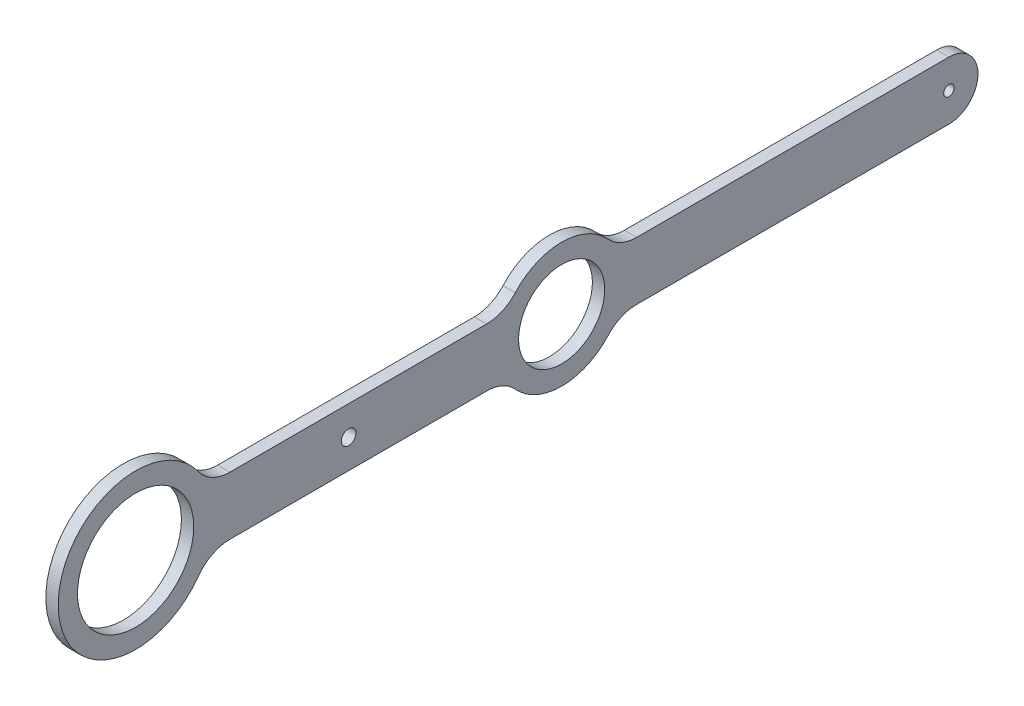
ISO-10303-21;
HEADER;
FILE_DESCRIPTION(('STEP AP214'),'2;1');
FILE_NAME('part.step','',(''),(''),'','','');
FILE_SCHEMA(('AUTOMOTIVE_DESIGN { 1 0 10303 214 1 1 1 1 }'));
ENDSEC;
DATA;
#1=APPLICATION_CONTEXT('core data for automotive mechanical design processes');
#2=APPLICATION_PROTOCOL_DEFINITION('international standard','automotive_design',2000,#1);
#3=PRODUCT_CONTEXT('',#1,'mechanical');
#4=PRODUCT('Part','Part','',(#3));
#5=PRODUCT_RELATED_PRODUCT_CATEGORY('part','',(#4));
#6=PRODUCT_DEFINITION_FORMATION('','',#4);
#7=PRODUCT_DEFINITION_CONTEXT('part definition',#1,'design');
#8=PRODUCT_DEFINITION('design','',#6,#7);
#9=PRODUCT_DEFINITION_SHAPE('','',#8);
#10=(LENGTH_UNIT() NAMED_UNIT(*) SI_UNIT(.MILLI.,.METRE.));
#11=(NAMED_UNIT(*) PLANE_ANGLE_UNIT() SI_UNIT($,.RADIAN.));
#12=(NAMED_UNIT(*) SI_UNIT($,.STERADIAN.) SOLID_ANGLE_UNIT());
#13=UNCERTAINTY_MEASURE_WITH_UNIT(LENGTH_MEASURE(1.E-05),#10,'distance_accuracy_value','');
#14=(GEOMETRIC_REPRESENTATION_CONTEXT(3) GLOBAL_UNCERTAINTY_ASSIGNED_CONTEXT((#13)) GLOBAL_UNIT_ASSIGNED_CONTEXT((#10,
#11,#12)) REPRESENTATION_CONTEXT('',''));
#15=CARTESIAN_POINT('',(0.,0.,0.));
#16=DIRECTION('',(0.,0.,1.));
#17=DIRECTION('',(1.,0.,0.));
#18=AXIS2_PLACEMENT_3D('',#15,#16,#17);
#19=CARTESIAN_POINT('',(3.175,0.,110.));
#20=DIRECTION('',(-1.,0.,0.));
#21=DIRECTION('',(0.,0.,1.));
#22=AXIS2_PLACEMENT_3D('',#19,#20,#21);
#23=CYLINDRICAL_SURFACE('',#22,20.);
#24=CARTESIAN_POINT('',(0.,0.,110.));
#25=DIRECTION('',(1.,0.,0.));
#26=DIRECTION('',(0.,0.,-1.));
#27=AXIS2_PLACEMENT_3D('',#24,#25,#26);
#28=CIRCLE('',#27,20.);
#29=CARTESIAN_POINT('',(0.,11.6666666666667,93.7553427586517));
#30=VERTEX_POINT('',#29);
#31=CARTESIAN_POINT('',(0.,-11.6666666666667,93.7553427586517));
#32=VERTEX_POINT('',#31);
#33=EDGE_CURVE('E194',#30,#32,#28,.T.);
#34=ORIENTED_EDGE('',*,*,#33,.T.);
#35=DIRECTION('',(-1.,0.,0.));
#36=VECTOR('',#35,1.);
#37=CARTESIAN_POINT('',(3.175,-11.6666666666667,93.7553427586517));
#38=LINE('',#37,#36);
#39=CARTESIAN_POINT('',(3.175,-11.6666666666667,93.7553427586517));
#40=VERTEX_POINT('',#39);
#41=EDGE_CURVE('E60',#32,#40,#38,.F.);
#42=ORIENTED_EDGE('',*,*,#41,.T.);
#43=CARTESIAN_POINT('',(3.175,0.,110.));
#44=DIRECTION('',(1.,0.,0.));
#45=DIRECTION('',(0.,0.,-1.));
#46=AXIS2_PLACEMENT_3D('',#43,#44,#45);
#47=CIRCLE('',#46,20.);
#48=CARTESIAN_POINT('',(3.175,11.6666666666667,93.7553427586517));
#49=VERTEX_POINT('',#48);
#50=EDGE_CURVE('E223',#49,#40,#47,.T.);
#51=ORIENTED_EDGE('',*,*,#50,.F.);
#52=DIRECTION('',(-1.,0.,0.));
#53=VECTOR('',#52,1.);
#54=CARTESIAN_POINT('',(3.175,11.6666666666667,93.7553427586517));
#55=LINE('',#54,#53);
#56=EDGE_CURVE('E248',#49,#30,#55,.T.);
#57=ORIENTED_EDGE('',*,*,#56,.T.);
#58=EDGE_LOOP('',(#34,#42,#51,#57));
#59=FACE_BOUND('',#58,.T.);
#60=ADVANCED_FACE('F42',(#59),#23,.T.);
#61=CARTESIAN_POINT('',(3.175,-7.5,0.));
#62=DIRECTION('',(0.,1.,0.));
#63=DIRECTION('',(0.,0.,1.));
#64=AXIS2_PLACEMENT_3D('',#61,#62,#63);
#65=PLANE('',#64);
#66=DIRECTION('',(0.,0.,-1.));
#67=VECTOR('',#66,1.);
#68=CARTESIAN_POINT('',(0.,-7.5,0.));
#69=LINE('',#68,#67);
#70=CARTESIAN_POINT('',(0.,-7.5,85.6330141379776));
#71=VERTEX_POINT('',#70);
#72=CARTESIAN_POINT('',(0.,-7.5,19.3807289917072));
#73=VERTEX_POINT('',#72);
#74=EDGE_CURVE('E197',#71,#73,#69,.T.);
#75=ORIENTED_EDGE('',*,*,#74,.T.);
#76=DIRECTION('',(1.,0.,0.));
#77=VECTOR('',#76,1.);
#78=CARTESIAN_POINT('',(3.175,-7.5,19.3807289917072));
#79=LINE('',#78,#77);
#80=CARTESIAN_POINT('',(3.175,-7.5,19.3807289917072));
#81=VERTEX_POINT('',#80);
#82=EDGE_CURVE('E246',#73,#81,#79,.T.);
#83=ORIENTED_EDGE('',*,*,#82,.T.);
#84=DIRECTION('',(0.,0.,-1.));
#85=VECTOR('',#84,1.);
#86=CARTESIAN_POINT('',(3.175,-7.5,0.));
#87=LINE('',#86,#85);
#88=CARTESIAN_POINT('',(3.175,-7.5,85.6330141379776));
#89=VERTEX_POINT('',#88);
#90=EDGE_CURVE('E287',#89,#81,#87,.T.);
#91=ORIENTED_EDGE('',*,*,#90,.F.);
#92=DIRECTION('',(1.,0.,0.));
#93=VECTOR('',#92,1.);
#94=CARTESIAN_POINT('',(0.,-7.5,85.6330141379776));
#95=LINE('',#94,#93);
#96=EDGE_CURVE('E243',#89,#71,#95,.F.);
#97=ORIENTED_EDGE('',*,*,#96,.T.);
#98=EDGE_LOOP('',(#75,#83,#91,#97));
#99=FACE_BOUND('',#98,.T.);
#100=ADVANCED_FACE('F328',(#99),#65,.F.);
#101=CARTESIAN_POINT('',(3.175,0.,0.));
#102=DIRECTION('',(-1.,0.,0.));
#103=DIRECTION('',(0.,0.,1.));
#104=AXIS2_PLACEMENT_3D('',#101,#102,#103);
#105=CYLINDRICAL_SURFACE('',#104,16.1125);
#106=CARTESIAN_POINT('',(0.,0.,0.));
#107=DIRECTION('',(1.,0.,0.));
#108=DIRECTION('',(0.,0.,-1.));
#109=AXIS2_PLACEMENT_3D('',#106,#107,#108);
#110=CIRCLE('',#109,16.1125);
#111=CARTESIAN_POINT('',(0.,-10.7982288176161,11.9587169316949));
#112=VERTEX_POINT('',#111);
#113=CARTESIAN_POINT('',(0.,-10.7982288176161,-11.9587169316949));
#114=VERTEX_POINT('',#113);
#115=EDGE_CURVE('E201',#112,#114,#110,.T.);
#116=ORIENTED_EDGE('',*,*,#115,.T.);
#117=DIRECTION('',(-1.,0.,0.));
#118=VECTOR('',#117,1.);
#119=CARTESIAN_POINT('',(3.175,-10.7982288176161,-11.9587169316949));
#120=LINE('',#119,#118);
#121=CARTESIAN_POINT('',(3.175,-10.7982288176161,-11.9587169316949));
#122=VERTEX_POINT('',#121);
#123=EDGE_CURVE('E241',#114,#122,#120,.F.);
#124=ORIENTED_EDGE('',*,*,#123,.T.);
#125=CARTESIAN_POINT('',(3.175,0.,0.));
#126=DIRECTION('',(1.,0.,0.));
#127=DIRECTION('',(0.,0.,-1.));
#128=AXIS2_PLACEMENT_3D('',#125,#126,#127);
#129=CIRCLE('',#128,16.1125);
#130=CARTESIAN_POINT('',(3.175,-10.7982288176161,11.9587169316949));
#131=VERTEX_POINT('',#130);
#132=EDGE_CURVE('E159',#131,#122,#129,.T.);
#133=ORIENTED_EDGE('',*,*,#132,.F.);
#134=DIRECTION('',(-1.,0.,0.));
#135=VECTOR('',#134,1.);
#136=CARTESIAN_POINT('',(3.175,-10.7982288176161,11.9587169316949));
#137=LINE('',#136,#135);
#138=EDGE_CURVE('E238',#131,#112,#137,.T.);
#139=ORIENTED_EDGE('',*,*,#138,.T.);
#140=EDGE_LOOP('',(#116,#124,#133,#139));
#141=FACE_BOUND('',#140,.T.);
#142=ADVANCED_FACE('F333',(#141),#105,.T.);
#143=CARTESIAN_POINT('',(3.175,-7.50000000000001,0.));
#144=DIRECTION('',(0.,1.,0.));
#145=DIRECTION('',(0.,0.,1.));
#146=AXIS2_PLACEMENT_3D('',#143,#144,#145);
#147=PLANE('',#146);
#148=DIRECTION('',(0.,0.,-1.));
#149=VECTOR('',#148,1.);
#150=CARTESIAN_POINT('',(3.175,-7.50000000000001,0.));
#151=LINE('',#150,#149);
#152=CARTESIAN_POINT('',(3.175,-7.5,-19.3807289917072));
#153=VERTEX_POINT('',#152);
#154=CARTESIAN_POINT('',(3.175,-7.49999999999996,-100.));
#155=VERTEX_POINT('',#154);
#156=EDGE_CURVE('E146',#153,#155,#151,.T.);
#157=ORIENTED_EDGE('',*,*,#156,.F.);
#158=DIRECTION('',(1.,0.,0.));
#159=VECTOR('',#158,1.);
#160=CARTESIAN_POINT('',(0.,-7.5,-19.3807289917072));
#161=LINE('',#160,#159);
#162=CARTESIAN_POINT('',(0.,-7.5,-19.3807289917072));
#163=VERTEX_POINT('',#162);
#164=EDGE_CURVE('E236',#153,#163,#161,.F.);
#165=ORIENTED_EDGE('',*,*,#164,.T.);
#166=DIRECTION('',(0.,0.,-1.));
#167=VECTOR('',#166,1.);
#168=CARTESIAN_POINT('',(0.,-7.50000000000001,0.));
#169=LINE('',#168,#167);
#170=CARTESIAN_POINT('',(0.,-7.49999999999996,-100.));
#171=VERTEX_POINT('',#170);
#172=EDGE_CURVE('E165',#163,#171,#169,.T.);
#173=ORIENTED_EDGE('',*,*,#172,.T.);
#174=DIRECTION('',(-1.,0.,0.));
#175=VECTOR('',#174,1.);
#176=CARTESIAN_POINT('',(3.175,-7.49999999999996,-100.));
#177=LINE('',#176,#175);
#178=EDGE_CURVE('E162',#155,#171,#177,.T.);
#179=ORIENTED_EDGE('',*,*,#178,.F.);
#180=EDGE_LOOP('',(#157,#165,#173,#179));
#181=FACE_BOUND('',#180,.T.);
#182=ADVANCED_FACE('F163',(#181),#147,.F.);
#183=CARTESIAN_POINT('',(3.175,0.,-100.));
#184=DIRECTION('',(-1.,0.,0.));
#185=DIRECTION('',(0.,0.,1.));
#186=AXIS2_PLACEMENT_3D('',#183,#184,#185);
#187=CYLINDRICAL_SURFACE('',#186,7.5);
#188=CARTESIAN_POINT('',(0.,0.,-100.));
#189=DIRECTION('',(1.,0.,0.));
#190=DIRECTION('',(0.,0.,-1.));
#191=AXIS2_PLACEMENT_3D('',#188,#189,#190);
#192=CIRCLE('',#191,7.5);
#193=CARTESIAN_POINT('',(0.,7.50000000000004,-100.));
#194=VERTEX_POINT('',#193);
#195=EDGE_CURVE('E205',#194,#171,#192,.F.);
#196=ORIENTED_EDGE('',*,*,#195,.F.);
#197=DIRECTION('',(-1.,0.,0.));
#198=VECTOR('',#197,1.);
#199=CARTESIAN_POINT('',(3.175,7.50000000000004,-100.));
#200=LINE('',#199,#198);
#201=CARTESIAN_POINT('',(3.175,7.50000000000004,-100.));
#202=VERTEX_POINT('',#201);
#203=EDGE_CURVE('E170',#202,#194,#200,.T.);
#204=ORIENTED_EDGE('',*,*,#203,.F.);
#205=CARTESIAN_POINT('',(3.175,0.,-100.));
#206=DIRECTION('',(1.,0.,0.));
#207=DIRECTION('',(0.,0.,-1.));
#208=AXIS2_PLACEMENT_3D('',#205,#206,#207);
#209=CIRCLE('',#208,7.5);
#210=EDGE_CURVE('E152',#202,#155,#209,.F.);
#211=ORIENTED_EDGE('',*,*,#210,.T.);
#212=ORIENTED_EDGE('',*,*,#178,.T.);
#213=EDGE_LOOP('',(#196,#204,#211,#212));
#214=FACE_BOUND('',#213,.T.);
#215=ADVANCED_FACE('F173',(#214),#187,.T.);
#216=CARTESIAN_POINT('',(3.175,7.49999999999999,0.));
#217=DIRECTION('',(0.,1.,0.));
#218=DIRECTION('',(0.,0.,1.));
#219=AXIS2_PLACEMENT_3D('',#216,#217,#218);
#220=PLANE('',#219);
#221=DIRECTION('',(0.,0.,-1.));
#222=VECTOR('',#221,1.);
#223=CARTESIAN_POINT('',(0.,7.49999999999999,0.));
#224=LINE('',#223,#222);
#225=CARTESIAN_POINT('',(0.,7.5,-19.3807289917072));
#226=VERTEX_POINT('',#225);
#227=EDGE_CURVE('E207',#226,#194,#224,.T.);
#228=ORIENTED_EDGE('',*,*,#227,.F.);
#229=DIRECTION('',(-1.,0.,0.));
#230=VECTOR('',#229,1.);
#231=CARTESIAN_POINT('',(3.175,7.5,-19.3807289917072));
#232=LINE('',#231,#230);
#233=CARTESIAN_POINT('',(3.175,7.5,-19.3807289917072));
#234=VERTEX_POINT('',#233);
#235=EDGE_CURVE('E229',#226,#234,#232,.F.);
#236=ORIENTED_EDGE('',*,*,#235,.T.);
#237=DIRECTION('',(0.,0.,-1.));
#238=VECTOR('',#237,1.);
#239=CARTESIAN_POINT('',(3.175,7.49999999999999,0.));
#240=LINE('',#239,#238);
#241=EDGE_CURVE('E175',#234,#202,#240,.T.);
#242=ORIENTED_EDGE('',*,*,#241,.T.);
#243=ORIENTED_EDGE('',*,*,#203,.T.);
#244=EDGE_LOOP('',(#228,#236,#242,#243));
#245=FACE_BOUND('',#244,.T.);
#246=ADVANCED_FACE('F305',(#245),#220,.T.);
#247=CARTESIAN_POINT('',(3.175,0.,0.));
#248=DIRECTION('',(-1.,0.,0.));
#249=DIRECTION('',(0.,0.,1.));
#250=AXIS2_PLACEMENT_3D('',#247,#248,#249);
#251=CYLINDRICAL_SURFACE('',#250,16.1125);
#252=CARTESIAN_POINT('',(3.175,0.,0.));
#253=DIRECTION('',(1.,0.,0.));
#254=DIRECTION('',(0.,0.,-1.));
#255=AXIS2_PLACEMENT_3D('',#252,#253,#254);
#256=CIRCLE('',#255,16.1125);
#257=CARTESIAN_POINT('',(3.175,10.7982288176161,-11.9587169316949));
#258=VERTEX_POINT('',#257);
#259=CARTESIAN_POINT('',(3.175,10.7982288176161,11.9587169316949));
#260=VERTEX_POINT('',#259);
#261=EDGE_CURVE('E177',#258,#260,#256,.T.);
#262=ORIENTED_EDGE('',*,*,#261,.F.);
#263=DIRECTION('',(-1.,0.,0.));
#264=VECTOR('',#263,1.);
#265=CARTESIAN_POINT('',(3.175,10.7982288176161,-11.9587169316949));
#266=LINE('',#265,#264);
#267=CARTESIAN_POINT('',(0.,10.7982288176161,-11.9587169316949));
#268=VERTEX_POINT('',#267);
#269=EDGE_CURVE('E226',#258,#268,#266,.T.);
#270=ORIENTED_EDGE('',*,*,#269,.T.);
#271=CARTESIAN_POINT('',(0.,0.,0.));
#272=DIRECTION('',(1.,0.,0.));
#273=DIRECTION('',(0.,0.,-1.));
#274=AXIS2_PLACEMENT_3D('',#271,#272,#273);
#275=CIRCLE('',#274,16.1125);
#276=CARTESIAN_POINT('',(0.,10.7982288176161,11.9587169316949));
#277=VERTEX_POINT('',#276);
#278=EDGE_CURVE('E209',#268,#277,#275,.T.);
#279=ORIENTED_EDGE('',*,*,#278,.T.);
#280=DIRECTION('',(-1.,0.,0.));
#281=VECTOR('',#280,1.);
#282=CARTESIAN_POINT('',(3.175,10.7982288176161,11.9587169316949));
#283=LINE('',#282,#281);
#284=EDGE_CURVE('E169',#277,#260,#283,.F.);
#285=ORIENTED_EDGE('',*,*,#284,.T.);
#286=EDGE_LOOP('',(#262,#270,#279,#285));
#287=FACE_BOUND('',#286,.T.);
#288=ADVANCED_FACE('F312',(#287),#251,.T.);
#289=CARTESIAN_POINT('',(3.175,0.,0.));
#290=DIRECTION('',(-1.,0.,0.));
#291=DIRECTION('',(0.,0.,1.));
#292=AXIS2_PLACEMENT_3D('',#289,#290,#291);
#293=CYLINDRICAL_SURFACE('',#292,11.1125);
#294=CARTESIAN_POINT('',(3.175,0.,0.));
#295=DIRECTION('',(1.,0.,0.));
#296=DIRECTION('',(0.,0.,-1.));
#297=AXIS2_PLACEMENT_3D('',#294,#295,#296);
#298=CIRCLE('',#297,11.1125);
#299=CARTESIAN_POINT('',(3.175,0.,-11.1125));
#300=VERTEX_POINT('',#299);
#301=EDGE_CURVE('E187',#300,#300,#298,.T.);
#302=ORIENTED_EDGE('',*,*,#301,.T.);
#303=EDGE_LOOP('',(#302));
#304=FACE_BOUND('',#303,.T.);
#305=CARTESIAN_POINT('',(0.,0.,0.));
#306=DIRECTION('',(1.,0.,0.));
#307=DIRECTION('',(0.,0.,-1.));
#308=AXIS2_PLACEMENT_3D('',#305,#306,#307);
#309=CIRCLE('',#308,11.1125);
#310=CARTESIAN_POINT('',(0.,0.,-11.1125));
#311=VERTEX_POINT('',#310);
#312=EDGE_CURVE('E216',#311,#311,#309,.T.);
#313=ORIENTED_EDGE('',*,*,#312,.F.);
#314=EDGE_LOOP('',(#313));
#315=FACE_BOUND('',#314,.T.);
#316=ADVANCED_FACE('F347',(#304,#315),#293,.F.);
#317=CARTESIAN_POINT('',(3.175,7.5,0.));
#318=DIRECTION('',(0.,1.,0.));
#319=DIRECTION('',(0.,0.,1.));
#320=AXIS2_PLACEMENT_3D('',#317,#318,#319);
#321=PLANE('',#320);
#322=DIRECTION('',(0.,0.,-1.));
#323=VECTOR('',#322,1.);
#324=CARTESIAN_POINT('',(3.175,7.5,0.));
#325=LINE('',#324,#323);
#326=CARTESIAN_POINT('',(3.175,7.5,85.6330141379776));
#327=VERTEX_POINT('',#326);
#328=CARTESIAN_POINT('',(3.175,7.5,19.3807289917072));
#329=VERTEX_POINT('',#328);
#330=EDGE_CURVE('E183',#327,#329,#325,.T.);
#331=ORIENTED_EDGE('',*,*,#330,.T.);
#332=DIRECTION('',(-1.,0.,0.));
#333=VECTOR('',#332,1.);
#334=CARTESIAN_POINT('',(3.175,7.5,19.3807289917072));
#335=LINE('',#334,#333);
#336=CARTESIAN_POINT('',(0.,7.5,19.3807289917072));
#337=VERTEX_POINT('',#336);
#338=EDGE_CURVE('E233',#329,#337,#335,.T.);
#339=ORIENTED_EDGE('',*,*,#338,.T.);
#340=DIRECTION('',(0.,0.,-1.));
#341=VECTOR('',#340,1.);
#342=CARTESIAN_POINT('',(0.,7.5,0.));
#343=LINE('',#342,#341);
#344=CARTESIAN_POINT('',(0.,7.5,85.6330141379776));
#345=VERTEX_POINT('',#344);
#346=EDGE_CURVE('E212',#345,#337,#343,.T.);
#347=ORIENTED_EDGE('',*,*,#346,.F.);
#348=DIRECTION('',(-1.,0.,0.));
#349=VECTOR('',#348,1.);
#350=CARTESIAN_POINT('',(3.175,7.5,85.6330141379776));
#351=LINE('',#350,#349);
#352=EDGE_CURVE('E231',#345,#327,#351,.F.);
#353=ORIENTED_EDGE('',*,*,#352,.T.);
#354=EDGE_LOOP('',(#331,#339,#347,#353));
#355=FACE_BOUND('',#354,.T.);
#356=ADVANCED_FACE('F283',(#355),#321,.T.);
#357=CARTESIAN_POINT('',(3.175,0.,110.));
#358=DIRECTION('',(-1.,0.,0.));
#359=DIRECTION('',(0.,0.,1.));
#360=AXIS2_PLACEMENT_3D('',#357,#358,#359);
#361=CYLINDRICAL_SURFACE('',#360,15.);
#362=CARTESIAN_POINT('',(3.175,0.,110.));
#363=DIRECTION('',(1.,0.,0.));
#364=DIRECTION('',(0.,0.,-1.));
#365=AXIS2_PLACEMENT_3D('',#362,#363,#364);
#366=CIRCLE('',#365,15.);
#367=CARTESIAN_POINT('',(3.175,0.,95.));
#368=VERTEX_POINT('',#367);
#369=EDGE_CURVE('E190',#368,#368,#366,.T.);
#370=ORIENTED_EDGE('',*,*,#369,.T.);
#371=EDGE_LOOP('',(#370));
#372=FACE_BOUND('',#371,.T.);
#373=CARTESIAN_POINT('',(0.,0.,110.));
#374=DIRECTION('',(1.,0.,0.));
#375=DIRECTION('',(0.,0.,-1.));
#376=AXIS2_PLACEMENT_3D('',#373,#374,#375);
#377=CIRCLE('',#376,15.);
#378=CARTESIAN_POINT('',(0.,0.,95.));
#379=VERTEX_POINT('',#378);
#380=EDGE_CURVE('E219',#379,#379,#377,.T.);
#381=ORIENTED_EDGE('',*,*,#380,.F.);
#382=EDGE_LOOP('',(#381));
#383=FACE_BOUND('',#382,.T.);
#384=ADVANCED_FACE('F350',(#372,#383),#361,.F.);
#385=CARTESIAN_POINT('',(3.175,0.,0.));
#386=DIRECTION('',(1.,0.,0.));
#387=DIRECTION('',(0.,0.,-1.));
#388=AXIS2_PLACEMENT_3D('',#385,#386,#387);
#389=PLANE('',#388);
#390=CARTESIAN_POINT('',(3.175,0.,-100.));
#391=DIRECTION('',(1.,0.,0.));
#392=DIRECTION('',(0.,0.,-1.));
#393=AXIS2_PLACEMENT_3D('',#390,#391,#392);
#394=CIRCLE('',#393,1.35254999999999);
#395=CARTESIAN_POINT('',(3.175,0.,-101.35255));
#396=VERTEX_POINT('',#395);
#397=EDGE_CURVE('E377',#396,#396,#394,.T.);
#398=ORIENTED_EDGE('',*,*,#397,.F.);
#399=EDGE_LOOP('',(#398));
#400=FACE_BOUND('',#399,.T.);
#401=CARTESIAN_POINT('',(3.175,0.,55.));
#402=DIRECTION('',(1.,0.,0.));
#403=DIRECTION('',(0.,0.,-1.));
#404=AXIS2_PLACEMENT_3D('',#401,#402,#403);
#405=CIRCLE('',#404,1.89864999999999);
#406=CARTESIAN_POINT('',(3.175,0.,53.10135));
#407=VERTEX_POINT('',#406);
#408=EDGE_CURVE('E379',#407,#407,#405,.T.);
#409=ORIENTED_EDGE('',*,*,#408,.F.);
#410=EDGE_LOOP('',(#409));
#411=FACE_BOUND('',#410,.T.);
#412=ORIENTED_EDGE('',*,*,#330,.F.);
#413=CARTESIAN_POINT('',(3.175,17.5,85.6330141379776));
#414=DIRECTION('',(1.,0.,0.));
#415=DIRECTION('',(0.,0.,-1.));
#416=AXIS2_PLACEMENT_3D('',#413,#414,#415);
#417=CIRCLE('',#416,10.);
#418=EDGE_CURVE('E11',#327,#49,#417,.F.);
#419=ORIENTED_EDGE('',*,*,#418,.T.);
#420=ORIENTED_EDGE('',*,*,#50,.T.);
#421=CARTESIAN_POINT('',(3.175,-17.5,85.6330141379776));
#422=DIRECTION('',(1.,0.,0.));
#423=DIRECTION('',(0.,0.,-1.));
#424=AXIS2_PLACEMENT_3D('',#421,#422,#423);
#425=CIRCLE('',#424,10.);
#426=EDGE_CURVE('E271',#40,#89,#425,.F.);
#427=ORIENTED_EDGE('',*,*,#426,.T.);
#428=ORIENTED_EDGE('',*,*,#90,.T.);
#429=CARTESIAN_POINT('',(3.175,-17.5,19.3807289917072));
#430=DIRECTION('',(1.,0.,0.));
#431=DIRECTION('',(0.,0.,-1.));
#432=AXIS2_PLACEMENT_3D('',#429,#430,#431);
#433=CIRCLE('',#432,10.);
#434=EDGE_CURVE('E267',#81,#131,#433,.F.);
#435=ORIENTED_EDGE('',*,*,#434,.T.);
#436=ORIENTED_EDGE('',*,*,#132,.T.);
#437=CARTESIAN_POINT('',(3.175,-17.5,-19.3807289917072));
#438=DIRECTION('',(1.,0.,0.));
#439=DIRECTION('',(0.,0.,-1.));
#440=AXIS2_PLACEMENT_3D('',#437,#438,#439);
#441=CIRCLE('',#440,10.);
#442=EDGE_CURVE('E155',#122,#153,#441,.F.);
#443=ORIENTED_EDGE('',*,*,#442,.T.);
#444=ORIENTED_EDGE('',*,*,#156,.T.);
#445=ORIENTED_EDGE('',*,*,#210,.F.);
#446=ORIENTED_EDGE('',*,*,#241,.F.);
#447=CARTESIAN_POINT('',(3.175,17.5,-19.3807289917072));
#448=DIRECTION('',(1.,0.,0.));
#449=DIRECTION('',(0.,0.,-1.));
#450=AXIS2_PLACEMENT_3D('',#447,#448,#449);
#451=CIRCLE('',#450,10.);
#452=EDGE_CURVE('E256',#234,#258,#451,.F.);
#453=ORIENTED_EDGE('',*,*,#452,.T.);
#454=ORIENTED_EDGE('',*,*,#261,.T.);
#455=CARTESIAN_POINT('',(3.175,17.5,19.3807289917072));
#456=DIRECTION('',(1.,0.,0.));
#457=DIRECTION('',(0.,0.,-1.));
#458=AXIS2_PLACEMENT_3D('',#455,#456,#457);
#459=CIRCLE('',#458,10.);
#460=EDGE_CURVE('E260',#260,#329,#459,.F.);
#461=ORIENTED_EDGE('',*,*,#460,.T.);
#462=EDGE_LOOP('',(#412,#419,#420,#427,#428,#435,#436,#443,#444,#445,#446,#453,#454,#461));
#463=FACE_BOUND('',#462,.T.);
#464=ORIENTED_EDGE('',*,*,#301,.F.);
#465=EDGE_LOOP('',(#464));
#466=FACE_BOUND('',#465,.T.);
#467=ORIENTED_EDGE('',*,*,#369,.F.);
#468=EDGE_LOOP('',(#467));
#469=FACE_BOUND('',#468,.T.);
#470=ADVANCED_FACE('F148',(#400,#411,#463,#466,#469),#389,.T.);
#471=CARTESIAN_POINT('',(0.,0.,0.));
#472=DIRECTION('',(1.,0.,0.));
#473=DIRECTION('',(0.,0.,-1.));
#474=AXIS2_PLACEMENT_3D('',#471,#472,#473);
#475=PLANE('',#474);
#476=CARTESIAN_POINT('',(0.,0.,-100.));
#477=DIRECTION('',(1.,0.,0.));
#478=DIRECTION('',(0.,0.,-1.));
#479=AXIS2_PLACEMENT_3D('',#476,#477,#478);
#480=CIRCLE('',#479,1.35254999999999);
#481=CARTESIAN_POINT('',(0.,0.,-101.35255));
#482=VERTEX_POINT('',#481);
#483=EDGE_CURVE('E374',#482,#482,#480,.T.);
#484=ORIENTED_EDGE('',*,*,#483,.T.);
#485=EDGE_LOOP('',(#484));
#486=FACE_BOUND('',#485,.T.);
#487=CARTESIAN_POINT('',(0.,0.,55.));
#488=DIRECTION('',(1.,0.,0.));
#489=DIRECTION('',(0.,0.,-1.));
#490=AXIS2_PLACEMENT_3D('',#487,#488,#489);
#491=CIRCLE('',#490,1.89864999999999);
#492=CARTESIAN_POINT('',(0.,0.,53.10135));
#493=VERTEX_POINT('',#492);
#494=EDGE_CURVE('E198',#493,#493,#491,.T.);
#495=ORIENTED_EDGE('',*,*,#494,.T.);
#496=EDGE_LOOP('',(#495));
#497=FACE_BOUND('',#496,.T.);
#498=ORIENTED_EDGE('',*,*,#33,.F.);
#499=CARTESIAN_POINT('',(0.,17.5,85.6330141379776));
#500=DIRECTION('',(1.,0.,0.));
#501=DIRECTION('',(0.,0.,-1.));
#502=AXIS2_PLACEMENT_3D('',#499,#500,#501);
#503=CIRCLE('',#502,10.);
#504=EDGE_CURVE('E51',#30,#345,#503,.T.);
#505=ORIENTED_EDGE('',*,*,#504,.T.);
#506=ORIENTED_EDGE('',*,*,#346,.T.);
#507=CARTESIAN_POINT('',(0.,17.5,19.3807289917072));
#508=DIRECTION('',(1.,0.,0.));
#509=DIRECTION('',(0.,0.,-1.));
#510=AXIS2_PLACEMENT_3D('',#507,#508,#509);
#511=CIRCLE('',#510,10.);
#512=EDGE_CURVE('E258',#337,#277,#511,.T.);
#513=ORIENTED_EDGE('',*,*,#512,.T.);
#514=ORIENTED_EDGE('',*,*,#278,.F.);
#515=CARTESIAN_POINT('',(0.,17.5,-19.3807289917072));
#516=DIRECTION('',(1.,0.,0.));
#517=DIRECTION('',(0.,0.,-1.));
#518=AXIS2_PLACEMENT_3D('',#515,#516,#517);
#519=CIRCLE('',#518,10.);
#520=EDGE_CURVE('E254',#268,#226,#519,.T.);
#521=ORIENTED_EDGE('',*,*,#520,.T.);
#522=ORIENTED_EDGE('',*,*,#227,.T.);
#523=ORIENTED_EDGE('',*,*,#195,.T.);
#524=ORIENTED_EDGE('',*,*,#172,.F.);
#525=CARTESIAN_POINT('',(0.,-17.5,-19.3807289917072));
#526=DIRECTION('',(1.,0.,0.));
#527=DIRECTION('',(0.,0.,-1.));
#528=AXIS2_PLACEMENT_3D('',#525,#526,#527);
#529=CIRCLE('',#528,10.);
#530=EDGE_CURVE('E262',#163,#114,#529,.T.);
#531=ORIENTED_EDGE('',*,*,#530,.T.);
#532=ORIENTED_EDGE('',*,*,#115,.F.);
#533=CARTESIAN_POINT('',(0.,-17.5,19.3807289917072));
#534=DIRECTION('',(1.,0.,0.));
#535=DIRECTION('',(0.,0.,-1.));
#536=AXIS2_PLACEMENT_3D('',#533,#534,#535);
#537=CIRCLE('',#536,10.);
#538=EDGE_CURVE('E265',#112,#73,#537,.T.);
#539=ORIENTED_EDGE('',*,*,#538,.T.);
#540=ORIENTED_EDGE('',*,*,#74,.F.);
#541=CARTESIAN_POINT('',(0.,-17.5,85.6330141379776));
#542=DIRECTION('',(1.,0.,0.));
#543=DIRECTION('',(0.,0.,-1.));
#544=AXIS2_PLACEMENT_3D('',#541,#542,#543);
#545=CIRCLE('',#544,10.);
#546=EDGE_CURVE('E269',#71,#32,#545,.T.);
#547=ORIENTED_EDGE('',*,*,#546,.T.);
#548=EDGE_LOOP('',(#498,#505,#506,#513,#514,#521,#522,#523,#524,#531,#532,#539,#540,#547));
#549=FACE_BOUND('',#548,.T.);
#550=ORIENTED_EDGE('',*,*,#312,.T.);
#551=EDGE_LOOP('',(#550));
#552=FACE_BOUND('',#551,.T.);
#553=ORIENTED_EDGE('',*,*,#380,.T.);
#554=EDGE_LOOP('',(#553));
#555=FACE_BOUND('',#554,.T.);
#556=ADVANCED_FACE('F277',(#486,#497,#549,#552,#555),#475,.F.);
#557=CARTESIAN_POINT('',(3.175,0.,55.));
#558=DIRECTION('',(1.,0.,0.));
#559=DIRECTION('',(0.,0.,-1.));
#560=AXIS2_PLACEMENT_3D('',#557,#558,#559);
#561=CYLINDRICAL_SURFACE('',#560,1.89864999999999);
#562=ORIENTED_EDGE('',*,*,#494,.F.);
#563=EDGE_LOOP('',(#562));
#564=FACE_BOUND('',#563,.T.);
#565=ORIENTED_EDGE('',*,*,#408,.T.);
#566=EDGE_LOOP('',(#565));
#567=FACE_BOUND('',#566,.T.);
#568=ADVANCED_FACE('F359',(#564,#567),#561,.F.);
#569=CARTESIAN_POINT('',(3.175,0.,-100.));
#570=DIRECTION('',(1.,0.,0.));
#571=DIRECTION('',(0.,0.,-1.));
#572=AXIS2_PLACEMENT_3D('',#569,#570,#571);
#573=CYLINDRICAL_SURFACE('',#572,1.35254999999999);
#574=ORIENTED_EDGE('',*,*,#483,.F.);
#575=EDGE_LOOP('',(#574));
#576=FACE_BOUND('',#575,.T.);
#577=ORIENTED_EDGE('',*,*,#397,.T.);
#578=EDGE_LOOP('',(#577));
#579=FACE_BOUND('',#578,.T.);
#580=ADVANCED_FACE('F325',(#576,#579),#573,.F.);
#581=CARTESIAN_POINT('',(3.175,17.5,-19.3807289917072));
#582=DIRECTION('',(-1.,0.,0.));
#583=DIRECTION('',(0.,0.,1.));
#584=AXIS2_PLACEMENT_3D('',#581,#582,#583);
#585=CYLINDRICAL_SURFACE('',#584,10.);
#586=ORIENTED_EDGE('',*,*,#452,.F.);
#587=ORIENTED_EDGE('',*,*,#235,.F.);
#588=ORIENTED_EDGE('',*,*,#520,.F.);
#589=ORIENTED_EDGE('',*,*,#269,.F.);
#590=EDGE_LOOP('',(#586,#587,#588,#589));
#591=FACE_BOUND('',#590,.T.);
#592=ADVANCED_FACE('F310',(#591),#585,.F.);
#593=CARTESIAN_POINT('',(3.175,17.5,19.3807289917072));
#594=DIRECTION('',(-1.,0.,0.));
#595=DIRECTION('',(0.,0.,1.));
#596=AXIS2_PLACEMENT_3D('',#593,#594,#595);
#597=CYLINDRICAL_SURFACE('',#596,10.);
#598=ORIENTED_EDGE('',*,*,#460,.F.);
#599=ORIENTED_EDGE('',*,*,#284,.F.);
#600=ORIENTED_EDGE('',*,*,#512,.F.);
#601=ORIENTED_EDGE('',*,*,#338,.F.);
#602=EDGE_LOOP('',(#598,#599,#600,#601));
#603=FACE_BOUND('',#602,.T.);
#604=ADVANCED_FACE('F316',(#603),#597,.F.);
#605=CARTESIAN_POINT('',(3.175,-17.5,-19.3807289917072));
#606=DIRECTION('',(-1.,0.,0.));
#607=DIRECTION('',(0.,0.,1.));
#608=AXIS2_PLACEMENT_3D('',#605,#606,#607);
#609=CYLINDRICAL_SURFACE('',#608,10.);
#610=ORIENTED_EDGE('',*,*,#442,.F.);
#611=ORIENTED_EDGE('',*,*,#123,.F.);
#612=ORIENTED_EDGE('',*,*,#530,.F.);
#613=ORIENTED_EDGE('',*,*,#164,.F.);
#614=EDGE_LOOP('',(#610,#611,#612,#613));
#615=FACE_BOUND('',#614,.T.);
#616=ADVANCED_FACE('F299',(#615),#609,.F.);
#617=CARTESIAN_POINT('',(3.175,-17.5,19.3807289917072));
#618=DIRECTION('',(-1.,0.,0.));
#619=DIRECTION('',(0.,0.,1.));
#620=AXIS2_PLACEMENT_3D('',#617,#618,#619);
#621=CYLINDRICAL_SURFACE('',#620,10.);
#622=ORIENTED_EDGE('',*,*,#434,.F.);
#623=ORIENTED_EDGE('',*,*,#82,.F.);
#624=ORIENTED_EDGE('',*,*,#538,.F.);
#625=ORIENTED_EDGE('',*,*,#138,.F.);
#626=EDGE_LOOP('',(#622,#623,#624,#625));
#627=FACE_BOUND('',#626,.T.);
#628=ADVANCED_FACE('F323',(#627),#621,.F.);
#629=CARTESIAN_POINT('',(3.175,-17.5,85.6330141379776));
#630=DIRECTION('',(-1.,0.,0.));
#631=DIRECTION('',(0.,0.,1.));
#632=AXIS2_PLACEMENT_3D('',#629,#630,#631);
#633=CYLINDRICAL_SURFACE('',#632,10.);
#634=ORIENTED_EDGE('',*,*,#426,.F.);
#635=ORIENTED_EDGE('',*,*,#41,.F.);
#636=ORIENTED_EDGE('',*,*,#546,.F.);
#637=ORIENTED_EDGE('',*,*,#96,.F.);
#638=EDGE_LOOP('',(#634,#635,#636,#637));
#639=FACE_BOUND('',#638,.T.);
#640=ADVANCED_FACE('F419',(#639),#633,.F.);
#641=CARTESIAN_POINT('',(3.175,17.5,85.6330141379776));
#642=DIRECTION('',(-1.,0.,0.));
#643=DIRECTION('',(0.,0.,1.));
#644=AXIS2_PLACEMENT_3D('',#641,#642,#643);
#645=CYLINDRICAL_SURFACE('',#644,10.);
#646=ORIENTED_EDGE('',*,*,#418,.F.);
#647=ORIENTED_EDGE('',*,*,#352,.F.);
#648=ORIENTED_EDGE('',*,*,#504,.F.);
#649=ORIENTED_EDGE('',*,*,#56,.F.);
#650=EDGE_LOOP('',(#646,#647,#648,#649));
#651=FACE_BOUND('',#650,.T.);
#652=ADVANCED_FACE('F44',(#651),#645,.F.);
#653=CLOSED_SHELL('',(#60,#100,#142,#182,#215,#246,#288,#316,#356,#384,#470,#556,#568,#580,#592,
#604,#616,#628,#640,#652));
#654=MANIFOLD_SOLID_BREP('B2',#653);
#655=ADVANCED_BREP_SHAPE_REPRESENTATION('',(#18,#654),#14);
#656=SHAPE_DEFINITION_REPRESENTATION(#9,#655);
ENDSEC;
END-ISO-10303-21;
